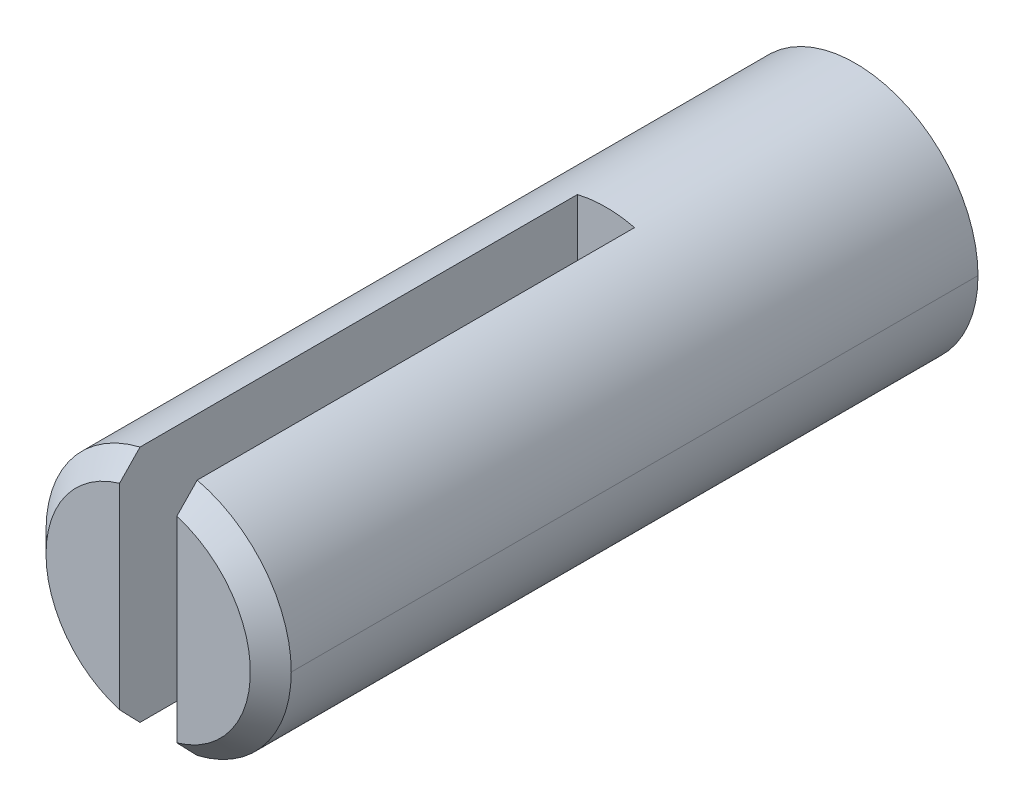
ISO-10303-21;
HEADER;
FILE_DESCRIPTION(('STEP AP214'),'2;1');
FILE_NAME('part.step','',(''),(''),'','','');
FILE_SCHEMA(('AUTOMOTIVE_DESIGN { 1 0 10303 214 1 1 1 1 }'));
ENDSEC;
DATA;
#1=APPLICATION_CONTEXT('core data for automotive mechanical design processes');
#2=APPLICATION_PROTOCOL_DEFINITION('international standard','automotive_design',2000,#1);
#3=PRODUCT_CONTEXT('',#1,'mechanical');
#4=PRODUCT('Part','Part','',(#3));
#5=PRODUCT_RELATED_PRODUCT_CATEGORY('part','',(#4));
#6=PRODUCT_DEFINITION_FORMATION('','',#4);
#7=PRODUCT_DEFINITION_CONTEXT('part definition',#1,'design');
#8=PRODUCT_DEFINITION('design','',#6,#7);
#9=PRODUCT_DEFINITION_SHAPE('','',#8);
#10=(LENGTH_UNIT() NAMED_UNIT(*) SI_UNIT(.MILLI.,.METRE.));
#11=(NAMED_UNIT(*) PLANE_ANGLE_UNIT() SI_UNIT($,.RADIAN.));
#12=(NAMED_UNIT(*) SI_UNIT($,.STERADIAN.) SOLID_ANGLE_UNIT());
#13=UNCERTAINTY_MEASURE_WITH_UNIT(LENGTH_MEASURE(1.E-05),#10,'distance_accuracy_value','');
#14=(GEOMETRIC_REPRESENTATION_CONTEXT(3) GLOBAL_UNCERTAINTY_ASSIGNED_CONTEXT((#13)) GLOBAL_UNIT_ASSIGNED_CONTEXT((#10,
#11,#12)) REPRESENTATION_CONTEXT('',''));
#15=CARTESIAN_POINT('',(0.,0.,0.));
#16=DIRECTION('',(0.,0.,1.));
#17=DIRECTION('',(1.,0.,0.));
#18=AXIS2_PLACEMENT_3D('',#15,#16,#17);
#19=CARTESIAN_POINT('',(0.,0.,0.));
#20=DIRECTION('',(0.,0.,-1.));
#21=DIRECTION('',(0.,-1.,0.));
#22=AXIS2_PLACEMENT_3D('',#19,#20,#21);
#23=PLANE('',#22);
#24=CARTESIAN_POINT('',(0.,0.,0.));
#25=DIRECTION('',(0.,0.,1.));
#26=DIRECTION('',(1.,0.,0.));
#27=AXIS2_PLACEMENT_3D('',#24,#25,#26);
#28=CIRCLE('',#27,1.75);
#29=CARTESIAN_POINT('',(1.75,0.,0.));
#30=VERTEX_POINT('',#29);
#31=CARTESIAN_POINT('',(-1.75,0.,0.));
#32=VERTEX_POINT('',#31);
#33=EDGE_CURVE('E173',#30,#32,#28,.T.);
#34=ORIENTED_EDGE('',*,*,#33,.F.);
#35=CARTESIAN_POINT('',(0.,0.,0.));
#36=DIRECTION('',(0.,0.,1.));
#37=DIRECTION('',(1.,0.,0.));
#38=AXIS2_PLACEMENT_3D('',#35,#36,#37);
#39=CIRCLE('',#38,1.75);
#40=EDGE_CURVE('E11',#32,#30,#39,.T.);
#41=ORIENTED_EDGE('',*,*,#40,.F.);
#42=EDGE_LOOP('',(#34,#41));
#43=FACE_BOUND('',#42,.T.);
#44=ADVANCED_FACE('F16',(#43),#23,.T.);
#45=CARTESIAN_POINT('',(0.,0.,0.));
#46=DIRECTION('',(0.,0.,1.));
#47=DIRECTION('',(1.,0.,0.));
#48=AXIS2_PLACEMENT_3D('',#45,#46,#47);
#49=CYLINDRICAL_SURFACE('',#48,1.75);
#50=DIRECTION('',(0.,0.,1.));
#51=VECTOR('',#50,1.);
#52=CARTESIAN_POINT('',(-1.75,0.,0.));
#53=LINE('',#52,#51);
#54=CARTESIAN_POINT('',(-1.75,0.,0.7));
#55=VERTEX_POINT('',#54);
#56=EDGE_CURVE('E177',#32,#55,#53,.T.);
#57=ORIENTED_EDGE('',*,*,#56,.F.);
#58=ORIENTED_EDGE('',*,*,#40,.T.);
#59=DIRECTION('',(0.,0.,1.));
#60=VECTOR('',#59,1.);
#61=CARTESIAN_POINT('',(1.75,0.,0.));
#62=LINE('',#61,#60);
#63=CARTESIAN_POINT('',(1.75,0.,0.7));
#64=VERTEX_POINT('',#63);
#65=EDGE_CURVE('E156',#30,#64,#62,.T.);
#66=ORIENTED_EDGE('',*,*,#65,.T.);
#67=CARTESIAN_POINT('',(0.,0.,0.7));
#68=DIRECTION('',(0.,0.,-1.));
#69=DIRECTION('',(1.,0.,0.));
#70=AXIS2_PLACEMENT_3D('',#67,#68,#69);
#71=CIRCLE('',#70,1.75);
#72=EDGE_CURVE('E27',#64,#55,#71,.T.);
#73=ORIENTED_EDGE('',*,*,#72,.T.);
#74=EDGE_LOOP('',(#57,#58,#66,#73));
#75=FACE_BOUND('',#74,.T.);
#76=ADVANCED_FACE('F301',(#75),#49,.T.);
#77=CARTESIAN_POINT('',(0.,0.,18.));
#78=DIRECTION('',(0.,0.,1.));
#79=DIRECTION('',(1.,0.,0.));
#80=AXIS2_PLACEMENT_3D('',#77,#78,#79);
#81=PLANE('',#80);
#82=DIRECTION('',(0.,-1.,0.));
#83=VECTOR('',#82,1.);
#84=CARTESIAN_POINT('',(-0.7,-3.,18.000000000027));
#85=LINE('',#84,#83);
#86=CARTESIAN_POINT('',(-0.7,2.39999999994,18.000000000028));
#87=VERTEX_POINT('',#86);
#88=CARTESIAN_POINT('',(-0.7,-2.399999999946,18.000000000022));
#89=VERTEX_POINT('',#88);
#90=EDGE_CURVE('E197',#87,#89,#85,.T.);
#91=ORIENTED_EDGE('',*,*,#90,.F.);
#92=CARTESIAN_POINT('',(0.,0.,18.000000000029));
#93=DIRECTION('',(0.,0.,-1.));
#94=DIRECTION('',(-1.,0.,0.));
#95=AXIS2_PLACEMENT_3D('',#92,#93,#94);
#96=CIRCLE('',#95,2.499999999941);
#97=CARTESIAN_POINT('',(-2.499999999941,0.,18.000000000029));
#98=VERTEX_POINT('',#97);
#99=EDGE_CURVE('E41',#98,#87,#96,.T.);
#100=ORIENTED_EDGE('',*,*,#99,.F.);
#101=CARTESIAN_POINT('',(0.,0.,18.000000000029));
#102=DIRECTION('',(0.,0.,-1.));
#103=DIRECTION('',(-1.,0.,0.));
#104=AXIS2_PLACEMENT_3D('',#101,#102,#103);
#105=CIRCLE('',#104,2.499999999941);
#106=EDGE_CURVE('E20',#89,#98,#105,.T.);
#107=ORIENTED_EDGE('',*,*,#106,.F.);
#108=EDGE_LOOP('',(#91,#100,#107));
#109=FACE_BOUND('',#108,.T.);
#110=ADVANCED_FACE('F307',(#109),#81,.T.);
#111=CARTESIAN_POINT('',(0.,0.,18.));
#112=DIRECTION('',(0.,0.,1.));
#113=DIRECTION('',(1.,0.,0.));
#114=AXIS2_PLACEMENT_3D('',#111,#112,#113);
#115=PLANE('',#114);
#116=DIRECTION('',(0.,1.,0.));
#117=VECTOR('',#116,1.);
#118=CARTESIAN_POINT('',(0.7,3.,18.000000000027));
#119=LINE('',#118,#117);
#120=CARTESIAN_POINT('',(0.7,-2.39999999994,18.000000000028));
#121=VERTEX_POINT('',#120);
#122=CARTESIAN_POINT('',(0.7,2.399999999946,18.000000000022));
#123=VERTEX_POINT('',#122);
#124=EDGE_CURVE('E139',#121,#123,#119,.T.);
#125=ORIENTED_EDGE('',*,*,#124,.F.);
#126=CARTESIAN_POINT('',(0.,0.,18.000000000029));
#127=DIRECTION('',(0.,0.,-1.));
#128=DIRECTION('',(-1.,0.,0.));
#129=AXIS2_PLACEMENT_3D('',#126,#127,#128);
#130=CIRCLE('',#129,2.499999999941);
#131=EDGE_CURVE('E134',#123,#121,#130,.T.);
#132=ORIENTED_EDGE('',*,*,#131,.F.);
#133=EDGE_LOOP('',(#125,#132));
#134=FACE_BOUND('',#133,.T.);
#135=ADVANCED_FACE('F315',(#134),#115,.T.);
#136=CARTESIAN_POINT('',(-0.7,3.,6.800000000027));
#137=DIRECTION('',(0.,0.,-1.));
#138=DIRECTION('',(0.,-1.,0.));
#139=AXIS2_PLACEMENT_3D('',#136,#137,#138);
#140=PLANE('',#139);
#141=CARTESIAN_POINT('',(0.,0.,6.800000000027));
#142=DIRECTION('',(0.,0.,-1.));
#143=DIRECTION('',(-1.,0.,0.));
#144=AXIS2_PLACEMENT_3D('',#141,#142,#143);
#145=CIRCLE('',#144,3.);
#146=CARTESIAN_POINT('',(0.7,-2.917190429163,6.800000000027));
#147=VERTEX_POINT('',#146);
#148=CARTESIAN_POINT('',(-0.7,-2.917190429163,6.800000000027));
#149=VERTEX_POINT('',#148);
#150=EDGE_CURVE('E149',#147,#149,#145,.T.);
#151=ORIENTED_EDGE('',*,*,#150,.F.);
#152=DIRECTION('',(0.,-1.,0.));
#153=VECTOR('',#152,1.);
#154=CARTESIAN_POINT('',(0.7,3.,6.800000000027));
#155=LINE('',#154,#153);
#156=CARTESIAN_POINT('',(0.7,2.917190429163,6.800000000027));
#157=VERTEX_POINT('',#156);
#158=EDGE_CURVE('E145',#157,#147,#155,.T.);
#159=ORIENTED_EDGE('',*,*,#158,.F.);
#160=CARTESIAN_POINT('',(0.,0.,6.800000000027));
#161=DIRECTION('',(0.,0.,-1.));
#162=DIRECTION('',(-1.,0.,0.));
#163=AXIS2_PLACEMENT_3D('',#160,#161,#162);
#164=CIRCLE('',#163,3.);
#165=CARTESIAN_POINT('',(-0.7,2.917190429163,6.800000000027));
#166=VERTEX_POINT('',#165);
#167=EDGE_CURVE('E167',#166,#157,#164,.T.);
#168=ORIENTED_EDGE('',*,*,#167,.F.);
#169=DIRECTION('',(0.,1.,0.));
#170=VECTOR('',#169,1.);
#171=CARTESIAN_POINT('',(-0.7,-3.,6.800000000027));
#172=LINE('',#171,#170);
#173=EDGE_CURVE('E198',#149,#166,#172,.T.);
#174=ORIENTED_EDGE('',*,*,#173,.F.);
#175=EDGE_LOOP('',(#151,#159,#168,#174));
#176=FACE_BOUND('',#175,.T.);
#177=ADVANCED_FACE('F311',(#176),#140,.F.);
#178=CARTESIAN_POINT('',(0.,0.,0.7));
#179=DIRECTION('',(0.,0.,1.));
#180=DIRECTION('',(1.,0.,0.));
#181=AXIS2_PLACEMENT_3D('',#178,#179,#180);
#182=PLANE('',#181);
#183=ORIENTED_EDGE('',*,*,#72,.F.);
#184=CARTESIAN_POINT('',(0.,0.,0.7));
#185=DIRECTION('',(0.,0.,-1.));
#186=DIRECTION('',(1.,0.,0.));
#187=AXIS2_PLACEMENT_3D('',#184,#185,#186);
#188=CIRCLE('',#187,1.75);
#189=EDGE_CURVE('E163',#55,#64,#188,.T.);
#190=ORIENTED_EDGE('',*,*,#189,.F.);
#191=EDGE_LOOP('',(#183,#190));
#192=FACE_BOUND('',#191,.T.);
#193=CARTESIAN_POINT('',(0.,0.,0.7));
#194=DIRECTION('',(0.,0.,1.));
#195=DIRECTION('',(-1.,0.,0.));
#196=AXIS2_PLACEMENT_3D('',#193,#194,#195);
#197=CIRCLE('',#196,3.);
#198=CARTESIAN_POINT('',(-3.,0.,0.7));
#199=VERTEX_POINT('',#198);
#200=CARTESIAN_POINT('',(3.,0.,0.7));
#201=VERTEX_POINT('',#200);
#202=EDGE_CURVE('E116',#199,#201,#197,.T.);
#203=ORIENTED_EDGE('',*,*,#202,.F.);
#204=CARTESIAN_POINT('',(0.,0.,0.7));
#205=DIRECTION('',(0.,0.,1.));
#206=DIRECTION('',(-1.,0.,0.));
#207=AXIS2_PLACEMENT_3D('',#204,#205,#206);
#208=CIRCLE('',#207,3.);
#209=EDGE_CURVE('E210',#201,#199,#208,.T.);
#210=ORIENTED_EDGE('',*,*,#209,.F.);
#211=EDGE_LOOP('',(#203,#210));
#212=FACE_BOUND('',#211,.T.);
#213=ADVANCED_FACE('F314',(#192,#212),#182,.F.);
#214=CARTESIAN_POINT('',(0.,0.,17.500000000098));
#215=DIRECTION('',(0.,0.,-1.));
#216=DIRECTION('',(-1.,0.,0.));
#217=AXIS2_PLACEMENT_3D('',#214,#215,#216);
#218=CONICAL_SURFACE('',#217,2.999999999872,0.785398163397);
#219=DIRECTION('',(-0.707106781186548,0.,-0.707106781186548));
#220=VECTOR('',#219,1.);
#221=CARTESIAN_POINT('',(-2.999999999872,0.,17.500000000098));
#222=LINE('',#221,#220);
#223=CARTESIAN_POINT('',(-2.99999999997,0.,17.5));
#224=VERTEX_POINT('',#223);
#225=EDGE_CURVE('E257',#98,#224,#222,.T.);
#226=ORIENTED_EDGE('',*,*,#225,.F.);
#227=ORIENTED_EDGE('',*,*,#99,.T.);
#228=CARTESIAN_POINT('',(-0.7,2.917190429156,17.499999999992));
#229=CARTESIAN_POINT('',(-0.700000000007,2.745278424634,17.667166684735));
#230=CARTESIAN_POINT('',(-0.7,2.572980252797,17.833938957285));
#231=CARTESIAN_POINT('',(-0.7,2.39999999994,18.000000000028));
#232=(BOUNDED_CURVE() B_SPLINE_CURVE(3,(#228,#229,#230,#231),.UNSPECIFIED.,.F.,
.F.) B_SPLINE_CURVE_WITH_KNOTS((4,4),(0.,0.0007193649561317),
.UNSPECIFIED.) CURVE() GEOMETRIC_REPRESENTATION_ITEM() RATIONAL_B_SPLINE_CURVE((1.,1.,1.,1.)) REPRESENTATION_ITEM(''));
#233=CARTESIAN_POINT('',(-0.7,2.917190429156,17.499999999992));
#234=VERTEX_POINT('',#233);
#235=EDGE_CURVE('E188',#234,#87,#232,.T.);
#236=ORIENTED_EDGE('',*,*,#235,.F.);
#237=CARTESIAN_POINT('',(0.,0.,17.5));
#238=DIRECTION('',(0.,0.,-1.));
#239=DIRECTION('',(-1.,0.,0.));
#240=AXIS2_PLACEMENT_3D('',#237,#238,#239);
#241=CIRCLE('',#240,3.);
#242=EDGE_CURVE('E182',#224,#234,#241,.T.);
#243=ORIENTED_EDGE('',*,*,#242,.F.);
#244=EDGE_LOOP('',(#226,#227,#236,#243));
#245=FACE_BOUND('',#244,.T.);
#246=ADVANCED_FACE('F317',(#245),#218,.T.);
#247=CARTESIAN_POINT('',(-0.7,-3.,6.800000000027));
#248=DIRECTION('',(1.,0.,0.));
#249=DIRECTION('',(0.,1.,0.));
#250=AXIS2_PLACEMENT_3D('',#247,#248,#249);
#251=PLANE('',#250);
#252=DIRECTION('',(0.,0.,-1.));
#253=VECTOR('',#252,1.);
#254=CARTESIAN_POINT('',(-0.7,2.917190429163,18.));
#255=LINE('',#254,#253);
#256=EDGE_CURVE('E172',#234,#166,#255,.T.);
#257=ORIENTED_EDGE('',*,*,#256,.F.);
#258=ORIENTED_EDGE('',*,*,#235,.T.);
#259=ORIENTED_EDGE('',*,*,#90,.T.);
#260=CARTESIAN_POINT('',(-0.7,-2.399999999946,18.000000000022));
#261=CARTESIAN_POINT('',(-0.700000000003,-2.572980252799,17.833938957286));
#262=CARTESIAN_POINT('',(-0.7,-2.74527842463,17.667166684731));
#263=CARTESIAN_POINT('',(-0.7,-2.917190429156,17.499999999992));
#264=(BOUNDED_CURVE() B_SPLINE_CURVE(3,(#260,#261,#262,#263),.UNSPECIFIED.,.F.,
.F.) B_SPLINE_CURVE_WITH_KNOTS((4,4),(0.,0.0007193649561121),
.UNSPECIFIED.) CURVE() GEOMETRIC_REPRESENTATION_ITEM() RATIONAL_B_SPLINE_CURVE((1.,1.,1.,1.)) REPRESENTATION_ITEM(''));
#265=CARTESIAN_POINT('',(-0.7,-2.917190429156,17.499999999992));
#266=VERTEX_POINT('',#265);
#267=EDGE_CURVE('E178',#89,#266,#264,.T.);
#268=ORIENTED_EDGE('',*,*,#267,.T.);
#269=DIRECTION('',(0.,0.,1.));
#270=VECTOR('',#269,1.);
#271=CARTESIAN_POINT('',(-0.7,-2.917190429163,18.));
#272=LINE('',#271,#270);
#273=EDGE_CURVE('E226',#149,#266,#272,.T.);
#274=ORIENTED_EDGE('',*,*,#273,.F.);
#275=ORIENTED_EDGE('',*,*,#173,.T.);
#276=EDGE_LOOP('',(#257,#258,#259,#268,#274,#275));
#277=FACE_BOUND('',#276,.T.);
#278=ADVANCED_FACE('F284',(#277),#251,.T.);
#279=CARTESIAN_POINT('',(0.,0.,17.500000000098));
#280=DIRECTION('',(0.,0.,-1.));
#281=DIRECTION('',(-1.,0.,0.));
#282=AXIS2_PLACEMENT_3D('',#279,#280,#281);
#283=CONICAL_SURFACE('',#282,2.999999999872,0.785398163397);
#284=CARTESIAN_POINT('',(0.7,2.399999999946,18.000000000022));
#285=CARTESIAN_POINT('',(0.700000000003,2.572980252799,17.833938957286));
#286=CARTESIAN_POINT('',(0.7,2.74527842463,17.667166684731));
#287=CARTESIAN_POINT('',(0.7,2.917190429156,17.499999999992));
#288=(BOUNDED_CURVE() B_SPLINE_CURVE(3,(#284,#285,#286,#287),.UNSPECIFIED.,.F.,
.F.) B_SPLINE_CURVE_WITH_KNOTS((4,4),(0.,0.0007193649561121),
.UNSPECIFIED.) CURVE() GEOMETRIC_REPRESENTATION_ITEM() RATIONAL_B_SPLINE_CURVE((1.,1.,1.,1.)) REPRESENTATION_ITEM(''));
#289=CARTESIAN_POINT('',(0.7,2.917190429156,17.499999999992));
#290=VERTEX_POINT('',#289);
#291=EDGE_CURVE('E183',#123,#290,#288,.T.);
#292=ORIENTED_EDGE('',*,*,#291,.F.);
#293=ORIENTED_EDGE('',*,*,#131,.T.);
#294=CARTESIAN_POINT('',(0.7,-2.917190429156,17.499999999992));
#295=CARTESIAN_POINT('',(0.700000000007,-2.745278424634,17.667166684735));
#296=CARTESIAN_POINT('',(0.7,-2.572980252797,17.833938957285));
#297=CARTESIAN_POINT('',(0.7,-2.39999999994,18.000000000028));
#298=(BOUNDED_CURVE() B_SPLINE_CURVE(3,(#294,#295,#296,#297),.UNSPECIFIED.,.F.,
.F.) B_SPLINE_CURVE_WITH_KNOTS((4,4),(0.,0.0007193649561317),
.UNSPECIFIED.) CURVE() GEOMETRIC_REPRESENTATION_ITEM() RATIONAL_B_SPLINE_CURVE((1.,1.,1.,1.)) REPRESENTATION_ITEM(''));
#299=CARTESIAN_POINT('',(0.7,-2.917190429156,17.499999999992));
#300=VERTEX_POINT('',#299);
#301=EDGE_CURVE('E127',#300,#121,#298,.T.);
#302=ORIENTED_EDGE('',*,*,#301,.F.);
#303=CARTESIAN_POINT('',(0.,0.,17.5));
#304=DIRECTION('',(0.,0.,-1.));
#305=DIRECTION('',(-1.,0.,0.));
#306=AXIS2_PLACEMENT_3D('',#303,#304,#305);
#307=CIRCLE('',#306,3.);
#308=CARTESIAN_POINT('',(3.,0.,17.5));
#309=VERTEX_POINT('',#308);
#310=EDGE_CURVE('E132',#309,#300,#307,.T.);
#311=ORIENTED_EDGE('',*,*,#310,.F.);
#312=CARTESIAN_POINT('',(0.,0.,17.5));
#313=DIRECTION('',(0.,0.,-1.));
#314=DIRECTION('',(-1.,0.,0.));
#315=AXIS2_PLACEMENT_3D('',#312,#313,#314);
#316=CIRCLE('',#315,3.);
#317=EDGE_CURVE('E222',#290,#309,#316,.T.);
#318=ORIENTED_EDGE('',*,*,#317,.F.);
#319=EDGE_LOOP('',(#292,#293,#302,#311,#318));
#320=FACE_BOUND('',#319,.T.);
#321=ADVANCED_FACE('F18',(#320),#283,.T.);
#322=CARTESIAN_POINT('',(0.7,3.,6.800000000027));
#323=DIRECTION('',(-1.,0.,0.));
#324=DIRECTION('',(0.,0.,1.));
#325=AXIS2_PLACEMENT_3D('',#322,#323,#324);
#326=PLANE('',#325);
#327=DIRECTION('',(0.,0.,-1.));
#328=VECTOR('',#327,1.);
#329=CARTESIAN_POINT('',(0.7,-2.917190429163,18.));
#330=LINE('',#329,#328);
#331=EDGE_CURVE('E142',#300,#147,#330,.T.);
#332=ORIENTED_EDGE('',*,*,#331,.F.);
#333=ORIENTED_EDGE('',*,*,#301,.T.);
#334=ORIENTED_EDGE('',*,*,#124,.T.);
#335=ORIENTED_EDGE('',*,*,#291,.T.);
#336=DIRECTION('',(0.,0.,1.));
#337=VECTOR('',#336,1.);
#338=CARTESIAN_POINT('',(0.7,2.917190429163,18.));
#339=LINE('',#338,#337);
#340=EDGE_CURVE('E171',#157,#290,#339,.T.);
#341=ORIENTED_EDGE('',*,*,#340,.F.);
#342=ORIENTED_EDGE('',*,*,#158,.T.);
#343=EDGE_LOOP('',(#332,#333,#334,#335,#341,#342));
#344=FACE_BOUND('',#343,.T.);
#345=ADVANCED_FACE('F143',(#344),#326,.T.);
#346=CARTESIAN_POINT('',(0.,0.,18.));
#347=DIRECTION('',(0.,0.,-1.));
#348=DIRECTION('',(-1.,0.,0.));
#349=AXIS2_PLACEMENT_3D('',#346,#347,#348);
#350=CYLINDRICAL_SURFACE('',#349,3.);
#351=DIRECTION('',(0.,0.,-1.));
#352=VECTOR('',#351,1.);
#353=CARTESIAN_POINT('',(3.,0.,18.));
#354=LINE('',#353,#352);
#355=EDGE_CURVE('E153',#309,#201,#354,.T.);
#356=ORIENTED_EDGE('',*,*,#355,.F.);
#357=ORIENTED_EDGE('',*,*,#310,.T.);
#358=ORIENTED_EDGE('',*,*,#331,.T.);
#359=ORIENTED_EDGE('',*,*,#150,.T.);
#360=ORIENTED_EDGE('',*,*,#273,.T.);
#361=CARTESIAN_POINT('',(0.,0.,17.5));
#362=DIRECTION('',(0.,0.,-1.));
#363=DIRECTION('',(-1.,0.,0.));
#364=AXIS2_PLACEMENT_3D('',#361,#362,#363);
#365=CIRCLE('',#364,3.);
#366=EDGE_CURVE('E109',#266,#224,#365,.T.);
#367=ORIENTED_EDGE('',*,*,#366,.T.);
#368=DIRECTION('',(0.,0.,-1.));
#369=VECTOR('',#368,1.);
#370=CARTESIAN_POINT('',(-3.,0.,18.));
#371=LINE('',#370,#369);
#372=EDGE_CURVE('E207',#224,#199,#371,.T.);
#373=ORIENTED_EDGE('',*,*,#372,.T.);
#374=ORIENTED_EDGE('',*,*,#202,.T.);
#375=EDGE_LOOP('',(#356,#357,#358,#359,#360,#367,#373,#374));
#376=FACE_BOUND('',#375,.T.);
#377=ADVANCED_FACE('F151',(#376),#350,.T.);
#378=CARTESIAN_POINT('',(0.,0.,0.));
#379=DIRECTION('',(0.,0.,1.));
#380=DIRECTION('',(1.,0.,0.));
#381=AXIS2_PLACEMENT_3D('',#378,#379,#380);
#382=CYLINDRICAL_SURFACE('',#381,1.75);
#383=ORIENTED_EDGE('',*,*,#33,.T.);
#384=ORIENTED_EDGE('',*,*,#56,.T.);
#385=ORIENTED_EDGE('',*,*,#189,.T.);
#386=ORIENTED_EDGE('',*,*,#65,.F.);
#387=EDGE_LOOP('',(#383,#384,#385,#386));
#388=FACE_BOUND('',#387,.T.);
#389=ADVANCED_FACE('F288',(#388),#382,.T.);
#390=CARTESIAN_POINT('',(0.,0.,17.500000000098));
#391=DIRECTION('',(0.,0.,-1.));
#392=DIRECTION('',(-1.,0.,0.));
#393=AXIS2_PLACEMENT_3D('',#390,#391,#392);
#394=CONICAL_SURFACE('',#393,2.999999999872,0.785398163397);
#395=ORIENTED_EDGE('',*,*,#106,.T.);
#396=ORIENTED_EDGE('',*,*,#225,.T.);
#397=ORIENTED_EDGE('',*,*,#366,.F.);
#398=ORIENTED_EDGE('',*,*,#267,.F.);
#399=EDGE_LOOP('',(#395,#396,#397,#398));
#400=FACE_BOUND('',#399,.T.);
#401=ADVANCED_FACE('F285',(#400),#394,.T.);
#402=CARTESIAN_POINT('',(0.,0.,18.));
#403=DIRECTION('',(0.,0.,-1.));
#404=DIRECTION('',(-1.,0.,0.));
#405=AXIS2_PLACEMENT_3D('',#402,#403,#404);
#406=CYLINDRICAL_SURFACE('',#405,3.);
#407=ORIENTED_EDGE('',*,*,#317,.T.);
#408=ORIENTED_EDGE('',*,*,#355,.T.);
#409=ORIENTED_EDGE('',*,*,#209,.T.);
#410=ORIENTED_EDGE('',*,*,#372,.F.);
#411=ORIENTED_EDGE('',*,*,#242,.T.);
#412=ORIENTED_EDGE('',*,*,#256,.T.);
#413=ORIENTED_EDGE('',*,*,#167,.T.);
#414=ORIENTED_EDGE('',*,*,#340,.T.);
#415=EDGE_LOOP('',(#407,#408,#409,#410,#411,#412,#413,#414));
#416=FACE_BOUND('',#415,.T.);
#417=ADVANCED_FACE('F287',(#416),#406,.T.);
#418=CLOSED_SHELL('',(#44,#76,#110,#135,#177,#213,#246,#278,#321,#345,#377,#389,#401,#417));
#419=MANIFOLD_SOLID_BREP('B1',#418);
#420=ADVANCED_BREP_SHAPE_REPRESENTATION('',(#18,#419),#14);
#421=SHAPE_DEFINITION_REPRESENTATION(#9,#420);
ENDSEC;
END-ISO-10303-21;
